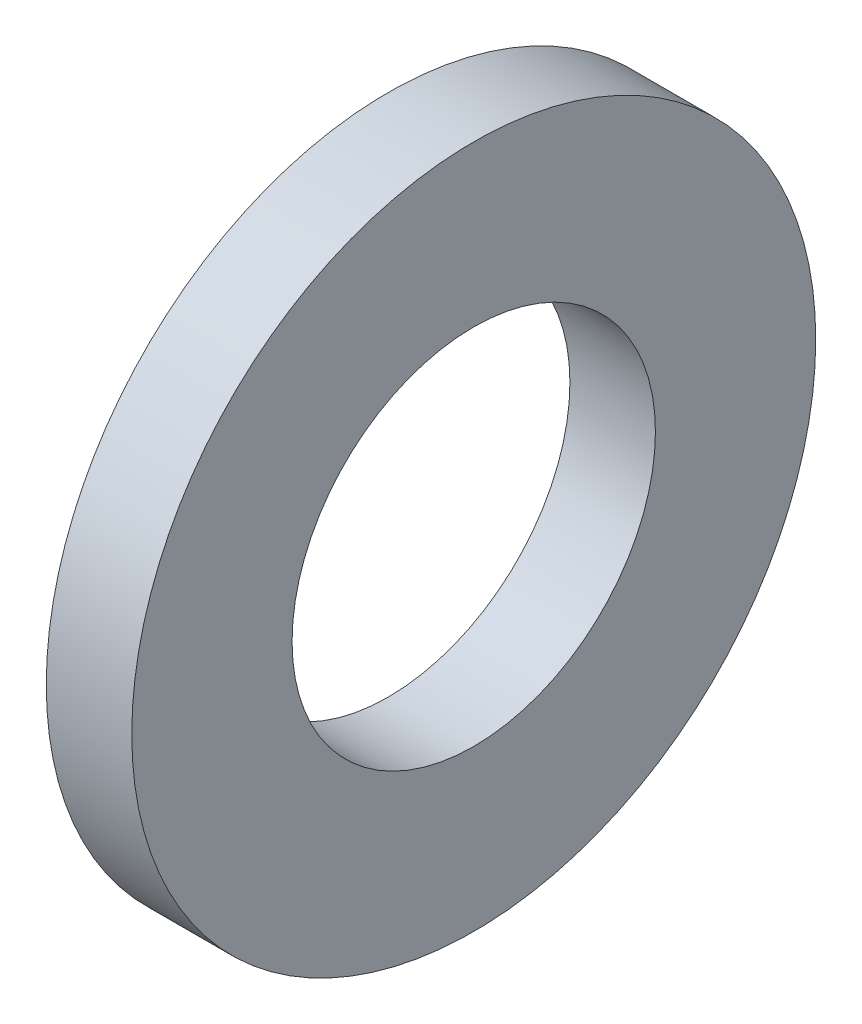
ISO-10303-21;
HEADER;
FILE_DESCRIPTION(('STEP AP214'),'2;1');
FILE_NAME('part.step','',(''),(''),'','','');
FILE_SCHEMA(('AUTOMOTIVE_DESIGN { 1 0 10303 214 1 1 1 1 }'));
ENDSEC;
DATA;
#1=APPLICATION_CONTEXT('core data for automotive mechanical design processes');
#2=APPLICATION_PROTOCOL_DEFINITION('international standard','automotive_design',2000,#1);
#3=PRODUCT_CONTEXT('',#1,'mechanical');
#4=PRODUCT('Part','Part','',(#3));
#5=PRODUCT_RELATED_PRODUCT_CATEGORY('part','',(#4));
#6=PRODUCT_DEFINITION_FORMATION('','',#4);
#7=PRODUCT_DEFINITION_CONTEXT('part definition',#1,'design');
#8=PRODUCT_DEFINITION('design','',#6,#7);
#9=PRODUCT_DEFINITION_SHAPE('','',#8);
#10=(LENGTH_UNIT() NAMED_UNIT(*) SI_UNIT(.MILLI.,.METRE.));
#11=(NAMED_UNIT(*) PLANE_ANGLE_UNIT() SI_UNIT($,.RADIAN.));
#12=(NAMED_UNIT(*) SI_UNIT($,.STERADIAN.) SOLID_ANGLE_UNIT());
#13=UNCERTAINTY_MEASURE_WITH_UNIT(LENGTH_MEASURE(1.E-05),#10,'distance_accuracy_value','');
#14=(GEOMETRIC_REPRESENTATION_CONTEXT(3) GLOBAL_UNCERTAINTY_ASSIGNED_CONTEXT((#13)) GLOBAL_UNIT_ASSIGNED_CONTEXT((#10,
#11,#12)) REPRESENTATION_CONTEXT('',''));
#15=CARTESIAN_POINT('',(0.,0.,0.));
#16=DIRECTION('',(0.,0.,1.));
#17=DIRECTION('',(1.,0.,0.));
#18=AXIS2_PLACEMENT_3D('',#15,#16,#17);
#19=CARTESIAN_POINT('',(0.8,0.,0.));
#20=DIRECTION('',(1.,0.,0.));
#21=DIRECTION('',(0.,0.,-1.));
#22=AXIS2_PLACEMENT_3D('',#19,#20,#21);
#23=PLANE('',#22);
#24=CARTESIAN_POINT('',(0.8,0.,0.));
#25=DIRECTION('',(1.,0.,0.));
#26=DIRECTION('',(0.,0.,-1.));
#27=AXIS2_PLACEMENT_3D('',#24,#25,#26);
#28=CIRCLE('',#27,3.2);
#29=CARTESIAN_POINT('',(0.8,0.,-3.2));
#30=VERTEX_POINT('',#29);
#31=EDGE_CURVE('E10',#30,#30,#28,.T.);
#32=ORIENTED_EDGE('',*,*,#31,.T.);
#33=EDGE_LOOP('',(#32));
#34=FACE_BOUND('',#33,.T.);
#35=CARTESIAN_POINT('',(0.8,0.,0.));
#36=DIRECTION('',(1.,0.,0.));
#37=DIRECTION('',(0.,0.,-1.));
#38=AXIS2_PLACEMENT_3D('',#35,#36,#37);
#39=CIRCLE('',#38,1.7);
#40=CARTESIAN_POINT('',(0.8,0.,-1.7));
#41=VERTEX_POINT('',#40);
#42=EDGE_CURVE('E44',#41,#41,#39,.T.);
#43=ORIENTED_EDGE('',*,*,#42,.F.);
#44=EDGE_LOOP('',(#43));
#45=FACE_BOUND('',#44,.T.);
#46=ADVANCED_FACE('F33',(#34,#45),#23,.T.);
#47=CARTESIAN_POINT('',(0.,0.,0.));
#48=DIRECTION('',(1.,0.,0.));
#49=DIRECTION('',(0.,0.,-1.));
#50=AXIS2_PLACEMENT_3D('',#47,#48,#49);
#51=PLANE('',#50);
#52=CARTESIAN_POINT('',(0.,0.,0.));
#53=DIRECTION('',(1.,0.,0.));
#54=DIRECTION('',(0.,0.,-1.));
#55=AXIS2_PLACEMENT_3D('',#52,#53,#54);
#56=CIRCLE('',#55,3.2);
#57=CARTESIAN_POINT('',(0.,0.,-3.2));
#58=VERTEX_POINT('',#57);
#59=EDGE_CURVE('E37',#58,#58,#56,.T.);
#60=ORIENTED_EDGE('',*,*,#59,.F.);
#61=EDGE_LOOP('',(#60));
#62=FACE_BOUND('',#61,.T.);
#63=CARTESIAN_POINT('',(0.,0.,0.));
#64=DIRECTION('',(1.,0.,0.));
#65=DIRECTION('',(0.,0.,-1.));
#66=AXIS2_PLACEMENT_3D('',#63,#64,#65);
#67=CIRCLE('',#66,1.7);
#68=CARTESIAN_POINT('',(0.,0.,-1.7));
#69=VERTEX_POINT('',#68);
#70=EDGE_CURVE('E46',#69,#69,#67,.T.);
#71=ORIENTED_EDGE('',*,*,#70,.T.);
#72=EDGE_LOOP('',(#71));
#73=FACE_BOUND('',#72,.T.);
#74=ADVANCED_FACE('F56',(#62,#73),#51,.F.);
#75=CARTESIAN_POINT('',(0.8,0.,0.));
#76=DIRECTION('',(-1.,0.,0.));
#77=DIRECTION('',(0.,0.,1.));
#78=AXIS2_PLACEMENT_3D('',#75,#76,#77);
#79=CYLINDRICAL_SURFACE('',#78,3.2);
#80=ORIENTED_EDGE('',*,*,#31,.F.);
#81=EDGE_LOOP('',(#80));
#82=FACE_BOUND('',#81,.T.);
#83=ORIENTED_EDGE('',*,*,#59,.T.);
#84=EDGE_LOOP('',(#83));
#85=FACE_BOUND('',#84,.T.);
#86=ADVANCED_FACE('F35',(#82,#85),#79,.T.);
#87=CARTESIAN_POINT('',(0.8,0.,0.));
#88=DIRECTION('',(-1.,0.,0.));
#89=DIRECTION('',(0.,0.,1.));
#90=AXIS2_PLACEMENT_3D('',#87,#88,#89);
#91=CYLINDRICAL_SURFACE('',#90,1.7);
#92=ORIENTED_EDGE('',*,*,#42,.T.);
#93=EDGE_LOOP('',(#92));
#94=FACE_BOUND('',#93,.T.);
#95=ORIENTED_EDGE('',*,*,#70,.F.);
#96=EDGE_LOOP('',(#95));
#97=FACE_BOUND('',#96,.T.);
#98=ADVANCED_FACE('F52',(#94,#97),#91,.F.);
#99=CLOSED_SHELL('',(#46,#74,#86,#98));
#100=MANIFOLD_SOLID_BREP('B2',#99);
#101=ADVANCED_BREP_SHAPE_REPRESENTATION('',(#18,#100),#14);
#102=SHAPE_DEFINITION_REPRESENTATION(#9,#101);
ENDSEC;
END-ISO-10303-21;
